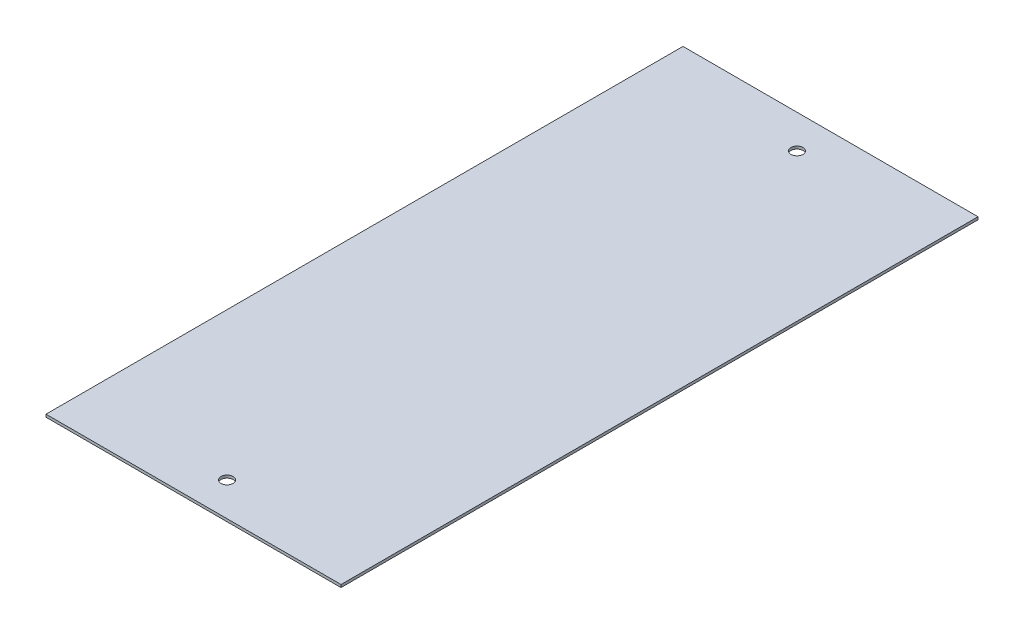
ISO-10303-21;
HEADER;
FILE_DESCRIPTION(('STEP AP214'),'2;1');
FILE_NAME('part.step','',(''),(''),'','','');
FILE_SCHEMA(('AUTOMOTIVE_DESIGN { 1 0 10303 214 1 1 1 1 }'));
ENDSEC;
DATA;
#1=APPLICATION_CONTEXT('core data for automotive mechanical design processes');
#2=APPLICATION_PROTOCOL_DEFINITION('international standard','automotive_design',2000,#1);
#3=PRODUCT_CONTEXT('',#1,'mechanical');
#4=PRODUCT('Part','Part','',(#3));
#5=PRODUCT_RELATED_PRODUCT_CATEGORY('part','',(#4));
#6=PRODUCT_DEFINITION_FORMATION('','',#4);
#7=PRODUCT_DEFINITION_CONTEXT('part definition',#1,'design');
#8=PRODUCT_DEFINITION('design','',#6,#7);
#9=PRODUCT_DEFINITION_SHAPE('','',#8);
#10=(LENGTH_UNIT() NAMED_UNIT(*) SI_UNIT(.MILLI.,.METRE.));
#11=(NAMED_UNIT(*) PLANE_ANGLE_UNIT() SI_UNIT($,.RADIAN.));
#12=(NAMED_UNIT(*) SI_UNIT($,.STERADIAN.) SOLID_ANGLE_UNIT());
#13=UNCERTAINTY_MEASURE_WITH_UNIT(LENGTH_MEASURE(1.E-05),#10,'distance_accuracy_value','');
#14=(GEOMETRIC_REPRESENTATION_CONTEXT(3) GLOBAL_UNCERTAINTY_ASSIGNED_CONTEXT((#13)) GLOBAL_UNIT_ASSIGNED_CONTEXT((#10,
#11,#12)) REPRESENTATION_CONTEXT('',''));
#15=CARTESIAN_POINT('',(0.,0.,0.));
#16=DIRECTION('',(0.,0.,1.));
#17=DIRECTION('',(1.,0.,0.));
#18=AXIS2_PLACEMENT_3D('',#15,#16,#17);
#19=CARTESIAN_POINT('',(0.,0.,475.));
#20=DIRECTION('',(1.,0.,0.));
#21=DIRECTION('',(0.,0.,-1.));
#22=AXIS2_PLACEMENT_3D('',#19,#20,#21);
#23=PLANE('',#22);
#24=DIRECTION('',(0.,-1.,0.));
#25=VECTOR('',#24,1.);
#26=CARTESIAN_POINT('',(0.,0.,0.));
#27=LINE('',#26,#25);
#28=CARTESIAN_POINT('',(0.,2.,0.));
#29=VERTEX_POINT('',#28);
#30=CARTESIAN_POINT('',(0.,0.,0.));
#31=VERTEX_POINT('',#30);
#32=EDGE_CURVE('E98',#29,#31,#27,.T.);
#33=ORIENTED_EDGE('',*,*,#32,.T.);
#34=DIRECTION('',(0.,0.,-1.));
#35=VECTOR('',#34,1.);
#36=CARTESIAN_POINT('',(0.,0.,475.));
#37=LINE('',#36,#35);
#38=CARTESIAN_POINT('',(0.,0.,475.));
#39=VERTEX_POINT('',#38);
#40=EDGE_CURVE('E11',#39,#31,#37,.T.);
#41=ORIENTED_EDGE('',*,*,#40,.F.);
#42=DIRECTION('',(0.,-1.,0.));
#43=VECTOR('',#42,1.);
#44=CARTESIAN_POINT('',(0.,0.,475.));
#45=LINE('',#44,#43);
#46=CARTESIAN_POINT('',(0.,2.,475.));
#47=VERTEX_POINT('',#46);
#48=EDGE_CURVE('E86',#47,#39,#45,.T.);
#49=ORIENTED_EDGE('',*,*,#48,.F.);
#50=DIRECTION('',(0.,0.,-1.));
#51=VECTOR('',#50,1.);
#52=CARTESIAN_POINT('',(0.,2.,475.));
#53=LINE('',#52,#51);
#54=EDGE_CURVE('E94',#47,#29,#53,.T.);
#55=ORIENTED_EDGE('',*,*,#54,.T.);
#56=EDGE_LOOP('',(#33,#41,#49,#55));
#57=FACE_BOUND('',#56,.T.);
#58=ADVANCED_FACE('F35',(#57),#23,.F.);
#59=CARTESIAN_POINT('',(0.,0.,475.));
#60=DIRECTION('',(0.,1.,0.));
#61=DIRECTION('',(0.,0.,1.));
#62=AXIS2_PLACEMENT_3D('',#59,#60,#61);
#63=PLANE('',#62);
#64=CARTESIAN_POINT('',(110.,0.,25.));
#65=DIRECTION('',(0.,1.,0.));
#66=DIRECTION('',(0.,0.,1.));
#67=AXIS2_PLACEMENT_3D('',#64,#65,#66);
#68=CIRCLE('',#67,4.5);
#69=CARTESIAN_POINT('',(110.,0.,29.5));
#70=VERTEX_POINT('',#69);
#71=EDGE_CURVE('E117',#70,#70,#68,.T.);
#72=ORIENTED_EDGE('',*,*,#71,.T.);
#73=EDGE_LOOP('',(#72));
#74=FACE_BOUND('',#73,.T.);
#75=CARTESIAN_POINT('',(110.,0.,450.));
#76=DIRECTION('',(0.,1.,0.));
#77=DIRECTION('',(0.,0.,1.));
#78=AXIS2_PLACEMENT_3D('',#75,#76,#77);
#79=CIRCLE('',#78,4.5);
#80=CARTESIAN_POINT('',(110.,0.,454.5));
#81=VERTEX_POINT('',#80);
#82=EDGE_CURVE('E101',#81,#81,#79,.T.);
#83=ORIENTED_EDGE('',*,*,#82,.T.);
#84=EDGE_LOOP('',(#83));
#85=FACE_BOUND('',#84,.T.);
#86=DIRECTION('',(1.,0.,0.));
#87=VECTOR('',#86,1.);
#88=CARTESIAN_POINT('',(0.,0.,0.));
#89=LINE('',#88,#87);
#90=CARTESIAN_POINT('',(220.,0.,0.));
#91=VERTEX_POINT('',#90);
#92=EDGE_CURVE('E90',#31,#91,#89,.T.);
#93=ORIENTED_EDGE('',*,*,#92,.T.);
#94=DIRECTION('',(0.,0.,-1.));
#95=VECTOR('',#94,1.);
#96=CARTESIAN_POINT('',(220.,0.,475.));
#97=LINE('',#96,#95);
#98=CARTESIAN_POINT('',(220.,0.,475.));
#99=VERTEX_POINT('',#98);
#100=EDGE_CURVE('E43',#99,#91,#97,.T.);
#101=ORIENTED_EDGE('',*,*,#100,.F.);
#102=DIRECTION('',(1.,0.,0.));
#103=VECTOR('',#102,1.);
#104=CARTESIAN_POINT('',(0.,0.,475.));
#105=LINE('',#104,#103);
#106=EDGE_CURVE('E81',#39,#99,#105,.T.);
#107=ORIENTED_EDGE('',*,*,#106,.F.);
#108=ORIENTED_EDGE('',*,*,#40,.T.);
#109=EDGE_LOOP('',(#93,#101,#107,#108));
#110=FACE_BOUND('',#109,.T.);
#111=ADVANCED_FACE('F89',(#74,#85,#110),#63,.F.);
#112=CARTESIAN_POINT('',(220.,0.,475.));
#113=DIRECTION('',(-1.,0.,0.));
#114=DIRECTION('',(0.,0.,1.));
#115=AXIS2_PLACEMENT_3D('',#112,#113,#114);
#116=PLANE('',#115);
#117=DIRECTION('',(0.,1.,0.));
#118=VECTOR('',#117,1.);
#119=CARTESIAN_POINT('',(220.,0.,0.));
#120=LINE('',#119,#118);
#121=CARTESIAN_POINT('',(220.,2.,0.));
#122=VERTEX_POINT('',#121);
#123=EDGE_CURVE('E68',#91,#122,#120,.T.);
#124=ORIENTED_EDGE('',*,*,#123,.T.);
#125=DIRECTION('',(0.,0.,-1.));
#126=VECTOR('',#125,1.);
#127=CARTESIAN_POINT('',(220.,2.,475.));
#128=LINE('',#127,#126);
#129=CARTESIAN_POINT('',(220.,2.,475.));
#130=VERTEX_POINT('',#129);
#131=EDGE_CURVE('E91',#130,#122,#128,.T.);
#132=ORIENTED_EDGE('',*,*,#131,.F.);
#133=DIRECTION('',(0.,1.,0.));
#134=VECTOR('',#133,1.);
#135=CARTESIAN_POINT('',(220.,0.,475.));
#136=LINE('',#135,#134);
#137=EDGE_CURVE('E84',#99,#130,#136,.T.);
#138=ORIENTED_EDGE('',*,*,#137,.F.);
#139=ORIENTED_EDGE('',*,*,#100,.T.);
#140=EDGE_LOOP('',(#124,#132,#138,#139));
#141=FACE_BOUND('',#140,.T.);
#142=ADVANCED_FACE('F92',(#141),#116,.F.);
#143=CARTESIAN_POINT('',(0.,2.,475.));
#144=DIRECTION('',(0.,-1.,0.));
#145=DIRECTION('',(1.,0.,0.));
#146=AXIS2_PLACEMENT_3D('',#143,#144,#145);
#147=PLANE('',#146);
#148=CARTESIAN_POINT('',(110.,2.,25.));
#149=DIRECTION('',(0.,1.,0.));
#150=DIRECTION('',(0.,0.,1.));
#151=AXIS2_PLACEMENT_3D('',#148,#149,#150);
#152=CIRCLE('',#151,4.5);
#153=CARTESIAN_POINT('',(110.,2.,29.5));
#154=VERTEX_POINT('',#153);
#155=EDGE_CURVE('E120',#154,#154,#152,.T.);
#156=ORIENTED_EDGE('',*,*,#155,.F.);
#157=EDGE_LOOP('',(#156));
#158=FACE_BOUND('',#157,.T.);
#159=CARTESIAN_POINT('',(110.,2.,450.));
#160=DIRECTION('',(0.,1.,0.));
#161=DIRECTION('',(0.,0.,1.));
#162=AXIS2_PLACEMENT_3D('',#159,#160,#161);
#163=CIRCLE('',#162,4.5);
#164=CARTESIAN_POINT('',(110.,2.,454.5));
#165=VERTEX_POINT('',#164);
#166=EDGE_CURVE('E114',#165,#165,#163,.T.);
#167=ORIENTED_EDGE('',*,*,#166,.F.);
#168=EDGE_LOOP('',(#167));
#169=FACE_BOUND('',#168,.T.);
#170=DIRECTION('',(-1.,0.,0.));
#171=VECTOR('',#170,1.);
#172=CARTESIAN_POINT('',(0.,2.,0.));
#173=LINE('',#172,#171);
#174=EDGE_CURVE('E74',#122,#29,#173,.T.);
#175=ORIENTED_EDGE('',*,*,#174,.T.);
#176=ORIENTED_EDGE('',*,*,#54,.F.);
#177=DIRECTION('',(-1.,0.,0.));
#178=VECTOR('',#177,1.);
#179=CARTESIAN_POINT('',(0.,2.,475.));
#180=LINE('',#179,#178);
#181=EDGE_CURVE('E51',#130,#47,#180,.T.);
#182=ORIENTED_EDGE('',*,*,#181,.F.);
#183=ORIENTED_EDGE('',*,*,#131,.T.);
#184=EDGE_LOOP('',(#175,#176,#182,#183));
#185=FACE_BOUND('',#184,.T.);
#186=ADVANCED_FACE('F106',(#158,#169,#185),#147,.F.);
#187=CARTESIAN_POINT('',(0.,0.,475.));
#188=DIRECTION('',(0.,0.,-1.));
#189=DIRECTION('',(-1.,0.,0.));
#190=AXIS2_PLACEMENT_3D('',#187,#188,#189);
#191=PLANE('',#190);
#192=ORIENTED_EDGE('',*,*,#48,.T.);
#193=ORIENTED_EDGE('',*,*,#106,.T.);
#194=ORIENTED_EDGE('',*,*,#137,.T.);
#195=ORIENTED_EDGE('',*,*,#181,.T.);
#196=EDGE_LOOP('',(#192,#193,#194,#195));
#197=FACE_BOUND('',#196,.T.);
#198=ADVANCED_FACE('F82',(#197),#191,.F.);
#199=CARTESIAN_POINT('',(0.,0.,0.));
#200=DIRECTION('',(0.,0.,-1.));
#201=DIRECTION('',(-1.,0.,0.));
#202=AXIS2_PLACEMENT_3D('',#199,#200,#201);
#203=PLANE('',#202);
#204=ORIENTED_EDGE('',*,*,#32,.F.);
#205=ORIENTED_EDGE('',*,*,#174,.F.);
#206=ORIENTED_EDGE('',*,*,#123,.F.);
#207=ORIENTED_EDGE('',*,*,#92,.F.);
#208=EDGE_LOOP('',(#204,#205,#206,#207));
#209=FACE_BOUND('',#208,.T.);
#210=ADVANCED_FACE('F109',(#209),#203,.T.);
#211=CARTESIAN_POINT('',(110.,2.,450.));
#212=DIRECTION('',(0.,1.,0.));
#213=DIRECTION('',(0.,0.,1.));
#214=AXIS2_PLACEMENT_3D('',#211,#212,#213);
#215=CYLINDRICAL_SURFACE('',#214,4.5);
#216=ORIENTED_EDGE('',*,*,#166,.T.);
#217=EDGE_LOOP('',(#216));
#218=FACE_BOUND('',#217,.T.);
#219=ORIENTED_EDGE('',*,*,#82,.F.);
#220=EDGE_LOOP('',(#219));
#221=FACE_BOUND('',#220,.T.);
#222=ADVANCED_FACE('F132',(#218,#221),#215,.F.);
#223=CARTESIAN_POINT('',(110.,2.,25.));
#224=DIRECTION('',(0.,1.,0.));
#225=DIRECTION('',(0.,0.,1.));
#226=AXIS2_PLACEMENT_3D('',#223,#224,#225);
#227=CYLINDRICAL_SURFACE('',#226,4.5);
#228=ORIENTED_EDGE('',*,*,#155,.T.);
#229=EDGE_LOOP('',(#228));
#230=FACE_BOUND('',#229,.T.);
#231=ORIENTED_EDGE('',*,*,#71,.F.);
#232=EDGE_LOOP('',(#231));
#233=FACE_BOUND('',#232,.T.);
#234=ADVANCED_FACE('F124',(#230,#233),#227,.F.);
#235=CLOSED_SHELL('',(#58,#111,#142,#186,#198,#210,#222,#234));
#236=MANIFOLD_SOLID_BREP('B2',#235);
#237=ADVANCED_BREP_SHAPE_REPRESENTATION('',(#18,#236),#14);
#238=SHAPE_DEFINITION_REPRESENTATION(#9,#237);
ENDSEC;
END-ISO-10303-21;
